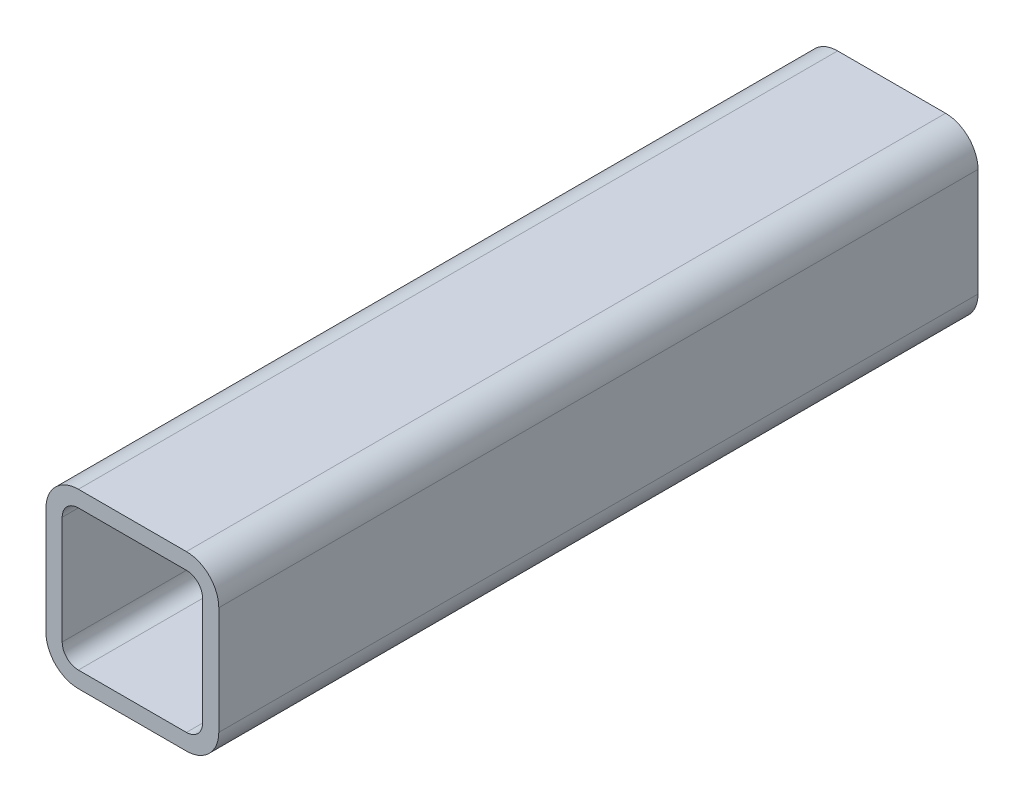
ISO-10303-21;
HEADER;
FILE_DESCRIPTION(('STEP AP214'),'2;1');
FILE_NAME('part.step','',(''),(''),'','','');
FILE_SCHEMA(('AUTOMOTIVE_DESIGN { 1 0 10303 214 1 1 1 1 }'));
ENDSEC;
DATA;
#1=APPLICATION_CONTEXT('core data for automotive mechanical design processes');
#2=APPLICATION_PROTOCOL_DEFINITION('international standard','automotive_design',2000,#1);
#3=PRODUCT_CONTEXT('',#1,'mechanical');
#4=PRODUCT('Part','Part','',(#3));
#5=PRODUCT_RELATED_PRODUCT_CATEGORY('part','',(#4));
#6=PRODUCT_DEFINITION_FORMATION('','',#4);
#7=PRODUCT_DEFINITION_CONTEXT('part definition',#1,'design');
#8=PRODUCT_DEFINITION('design','',#6,#7);
#9=PRODUCT_DEFINITION_SHAPE('','',#8);
#10=(LENGTH_UNIT() NAMED_UNIT(*) SI_UNIT(.MILLI.,.METRE.));
#11=(NAMED_UNIT(*) PLANE_ANGLE_UNIT() SI_UNIT($,.RADIAN.));
#12=(NAMED_UNIT(*) SI_UNIT($,.STERADIAN.) SOLID_ANGLE_UNIT());
#13=UNCERTAINTY_MEASURE_WITH_UNIT(LENGTH_MEASURE(1.E-05),#10,'distance_accuracy_value','');
#14=(GEOMETRIC_REPRESENTATION_CONTEXT(3) GLOBAL_UNCERTAINTY_ASSIGNED_CONTEXT((#13)) GLOBAL_UNIT_ASSIGNED_CONTEXT((#10,
#11,#12)) REPRESENTATION_CONTEXT('',''));
#15=CARTESIAN_POINT('',(0.,0.,0.));
#16=DIRECTION('',(0.,0.,1.));
#17=DIRECTION('',(1.,0.,0.));
#18=AXIS2_PLACEMENT_3D('',#15,#16,#17);
#19=CARTESIAN_POINT('',(41.27,41.27,223.2));
#20=DIRECTION('',(0.,0.,-1.));
#21=DIRECTION('',(-1.,0.,0.));
#22=AXIS2_PLACEMENT_3D('',#19,#20,#21);
#23=PLANE('',#22);
#24=CARTESIAN_POINT('',(41.27,41.27,223.2));
#25=DIRECTION('',(0.,0.,1.));
#26=DIRECTION('',(-1.,0.,0.));
#27=AXIS2_PLACEMENT_3D('',#24,#25,#26);
#28=CIRCLE('',#27,9.53);
#29=CARTESIAN_POINT('',(50.8,41.2699999999999,223.2));
#30=VERTEX_POINT('',#29);
#31=CARTESIAN_POINT('',(41.2699999999999,50.8,223.2));
#32=VERTEX_POINT('',#31);
#33=EDGE_CURVE('E246',#30,#32,#28,.T.);
#34=ORIENTED_EDGE('',*,*,#33,.T.);
#35=DIRECTION('',(-1.,0.,0.));
#36=VECTOR('',#35,1.);
#37=CARTESIAN_POINT('',(9.53000000000007,50.8,223.2));
#38=LINE('',#37,#36);
#39=CARTESIAN_POINT('',(9.53000000000007,50.8,223.2));
#40=VERTEX_POINT('',#39);
#41=EDGE_CURVE('E250',#32,#40,#38,.T.);
#42=ORIENTED_EDGE('',*,*,#41,.T.);
#43=CARTESIAN_POINT('',(9.53,41.27,223.2));
#44=DIRECTION('',(0.,0.,1.));
#45=DIRECTION('',(-1.,0.,0.));
#46=AXIS2_PLACEMENT_3D('',#43,#44,#45);
#47=CIRCLE('',#46,9.53);
#48=CARTESIAN_POINT('',(0.,41.2699999999999,223.2));
#49=VERTEX_POINT('',#48);
#50=EDGE_CURVE('E254',#40,#49,#47,.T.);
#51=ORIENTED_EDGE('',*,*,#50,.T.);
#52=DIRECTION('',(0.,-1.,0.));
#53=VECTOR('',#52,1.);
#54=CARTESIAN_POINT('',(0.,9.53000000000007,223.2));
#55=LINE('',#54,#53);
#56=CARTESIAN_POINT('',(0.,9.53000000000007,223.2));
#57=VERTEX_POINT('',#56);
#58=EDGE_CURVE('E257',#49,#57,#55,.T.);
#59=ORIENTED_EDGE('',*,*,#58,.T.);
#60=CARTESIAN_POINT('',(9.53,9.53,223.2));
#61=DIRECTION('',(0.,0.,1.));
#62=DIRECTION('',(-1.,0.,0.));
#63=AXIS2_PLACEMENT_3D('',#60,#61,#62);
#64=CIRCLE('',#63,9.53);
#65=CARTESIAN_POINT('',(9.53000000000007,0.,223.2));
#66=VERTEX_POINT('',#65);
#67=EDGE_CURVE('E260',#57,#66,#64,.T.);
#68=ORIENTED_EDGE('',*,*,#67,.T.);
#69=DIRECTION('',(1.,0.,0.));
#70=VECTOR('',#69,1.);
#71=CARTESIAN_POINT('',(9.53000000000007,0.,223.2));
#72=LINE('',#71,#70);
#73=CARTESIAN_POINT('',(41.2699999999999,0.,223.2));
#74=VERTEX_POINT('',#73);
#75=EDGE_CURVE('E263',#66,#74,#72,.T.);
#76=ORIENTED_EDGE('',*,*,#75,.T.);
#77=CARTESIAN_POINT('',(41.27,9.53,223.2));
#78=DIRECTION('',(0.,0.,1.));
#79=DIRECTION('',(-1.,0.,0.));
#80=AXIS2_PLACEMENT_3D('',#77,#78,#79);
#81=CIRCLE('',#80,9.53);
#82=CARTESIAN_POINT('',(50.8,9.53000000000007,223.2));
#83=VERTEX_POINT('',#82);
#84=EDGE_CURVE('E266',#74,#83,#81,.T.);
#85=ORIENTED_EDGE('',*,*,#84,.T.);
#86=DIRECTION('',(0.,1.,0.));
#87=VECTOR('',#86,1.);
#88=CARTESIAN_POINT('',(50.8,9.53000000000007,223.2));
#89=LINE('',#88,#87);
#90=EDGE_CURVE('E269',#83,#30,#89,.T.);
#91=ORIENTED_EDGE('',*,*,#90,.T.);
#92=EDGE_LOOP('',(#34,#42,#51,#59,#68,#76,#85,#91));
#93=FACE_BOUND('',#92,.T.);
#94=CARTESIAN_POINT('',(9.52,9.52,223.2));
#95=DIRECTION('',(0.,0.,1.));
#96=DIRECTION('',(1.,0.,0.));
#97=AXIS2_PLACEMENT_3D('',#94,#95,#96);
#98=CIRCLE('',#97,4.76);
#99=CARTESIAN_POINT('',(4.76,9.52000000000003,223.2));
#100=VERTEX_POINT('',#99);
#101=CARTESIAN_POINT('',(9.52000000000004,4.76,223.2));
#102=VERTEX_POINT('',#101);
#103=EDGE_CURVE('E157',#100,#102,#98,.T.);
#104=ORIENTED_EDGE('',*,*,#103,.F.);
#105=DIRECTION('',(0.,-1.,0.));
#106=VECTOR('',#105,1.);
#107=CARTESIAN_POINT('',(4.76,41.28,223.2));
#108=LINE('',#107,#106);
#109=CARTESIAN_POINT('',(4.76,41.28,223.2));
#110=VERTEX_POINT('',#109);
#111=EDGE_CURVE('E198',#110,#100,#108,.T.);
#112=ORIENTED_EDGE('',*,*,#111,.F.);
#113=CARTESIAN_POINT('',(9.52,41.28,223.2));
#114=DIRECTION('',(0.,0.,1.));
#115=DIRECTION('',(-1.,0.,0.));
#116=AXIS2_PLACEMENT_3D('',#113,#114,#115);
#117=CIRCLE('',#116,4.76);
#118=CARTESIAN_POINT('',(9.52000000000003,46.04,223.2));
#119=VERTEX_POINT('',#118);
#120=EDGE_CURVE('E195',#119,#110,#117,.T.);
#121=ORIENTED_EDGE('',*,*,#120,.F.);
#122=DIRECTION('',(-1.,0.,0.));
#123=VECTOR('',#122,1.);
#124=CARTESIAN_POINT('',(9.52000000000003,46.04,223.2));
#125=LINE('',#124,#123);
#126=CARTESIAN_POINT('',(41.28,46.04,223.2));
#127=VERTEX_POINT('',#126);
#128=EDGE_CURVE('E192',#127,#119,#125,.T.);
#129=ORIENTED_EDGE('',*,*,#128,.F.);
#130=CARTESIAN_POINT('',(41.28,41.28,223.2));
#131=DIRECTION('',(0.,0.,1.));
#132=DIRECTION('',(1.,0.,0.));
#133=AXIS2_PLACEMENT_3D('',#130,#131,#132);
#134=CIRCLE('',#133,4.76);
#135=CARTESIAN_POINT('',(46.04,41.28,223.2));
#136=VERTEX_POINT('',#135);
#137=EDGE_CURVE('E189',#136,#127,#134,.T.);
#138=ORIENTED_EDGE('',*,*,#137,.F.);
#139=DIRECTION('',(0.,1.,0.));
#140=VECTOR('',#139,1.);
#141=CARTESIAN_POINT('',(46.04,41.28,223.2));
#142=LINE('',#141,#140);
#143=CARTESIAN_POINT('',(46.04,9.52000000000003,223.2));
#144=VERTEX_POINT('',#143);
#145=EDGE_CURVE('E184',#144,#136,#142,.T.);
#146=ORIENTED_EDGE('',*,*,#145,.F.);
#147=CARTESIAN_POINT('',(41.28,9.52,223.2));
#148=DIRECTION('',(0.,0.,1.));
#149=DIRECTION('',(1.,0.,0.));
#150=AXIS2_PLACEMENT_3D('',#147,#148,#149);
#151=CIRCLE('',#150,4.76);
#152=CARTESIAN_POINT('',(41.28,4.76,223.2));
#153=VERTEX_POINT('',#152);
#154=EDGE_CURVE('E180',#153,#144,#151,.T.);
#155=ORIENTED_EDGE('',*,*,#154,.F.);
#156=DIRECTION('',(1.,0.,0.));
#157=VECTOR('',#156,1.);
#158=CARTESIAN_POINT('',(9.52000000000004,4.76,223.2));
#159=LINE('',#158,#157);
#160=EDGE_CURVE('E166',#102,#153,#159,.T.);
#161=ORIENTED_EDGE('',*,*,#160,.F.);
#162=EDGE_LOOP('',(#104,#112,#121,#129,#138,#146,#155,#161));
#163=FACE_BOUND('',#162,.T.);
#164=ADVANCED_FACE('F43',(#93,#163),#23,.F.);
#165=CARTESIAN_POINT('',(41.27,41.27,0.));
#166=DIRECTION('',(0.,0.,-1.));
#167=DIRECTION('',(-1.,0.,0.));
#168=AXIS2_PLACEMENT_3D('',#165,#166,#167);
#169=PLANE('',#168);
#170=CARTESIAN_POINT('',(41.27,41.27,0.));
#171=DIRECTION('',(0.,0.,1.));
#172=DIRECTION('',(-1.,0.,0.));
#173=AXIS2_PLACEMENT_3D('',#170,#171,#172);
#174=CIRCLE('',#173,9.53);
#175=CARTESIAN_POINT('',(50.8,41.2699999999999,0.));
#176=VERTEX_POINT('',#175);
#177=CARTESIAN_POINT('',(41.2699999999999,50.8,0.));
#178=VERTEX_POINT('',#177);
#179=EDGE_CURVE('E175',#176,#178,#174,.T.);
#180=ORIENTED_EDGE('',*,*,#179,.F.);
#181=DIRECTION('',(0.,1.,0.));
#182=VECTOR('',#181,1.);
#183=CARTESIAN_POINT('',(50.8,9.53000000000007,0.));
#184=LINE('',#183,#182);
#185=CARTESIAN_POINT('',(50.8,9.53000000000007,0.));
#186=VERTEX_POINT('',#185);
#187=EDGE_CURVE('E251',#186,#176,#184,.T.);
#188=ORIENTED_EDGE('',*,*,#187,.F.);
#189=CARTESIAN_POINT('',(41.27,9.53,0.));
#190=DIRECTION('',(0.,0.,1.));
#191=DIRECTION('',(-1.,0.,0.));
#192=AXIS2_PLACEMENT_3D('',#189,#190,#191);
#193=CIRCLE('',#192,9.53);
#194=CARTESIAN_POINT('',(41.2699999999999,0.,0.));
#195=VERTEX_POINT('',#194);
#196=EDGE_CURVE('E291',#195,#186,#193,.T.);
#197=ORIENTED_EDGE('',*,*,#196,.F.);
#198=DIRECTION('',(1.,0.,0.));
#199=VECTOR('',#198,1.);
#200=CARTESIAN_POINT('',(9.53000000000007,0.,0.));
#201=LINE('',#200,#199);
#202=CARTESIAN_POINT('',(9.53000000000007,0.,0.));
#203=VERTEX_POINT('',#202);
#204=EDGE_CURVE('E288',#203,#195,#201,.T.);
#205=ORIENTED_EDGE('',*,*,#204,.F.);
#206=CARTESIAN_POINT('',(9.53,9.53,0.));
#207=DIRECTION('',(0.,0.,1.));
#208=DIRECTION('',(-1.,0.,0.));
#209=AXIS2_PLACEMENT_3D('',#206,#207,#208);
#210=CIRCLE('',#209,9.53);
#211=CARTESIAN_POINT('',(0.,9.53000000000007,0.));
#212=VERTEX_POINT('',#211);
#213=EDGE_CURVE('E285',#212,#203,#210,.T.);
#214=ORIENTED_EDGE('',*,*,#213,.F.);
#215=DIRECTION('',(0.,-1.,0.));
#216=VECTOR('',#215,1.);
#217=CARTESIAN_POINT('',(0.,9.53000000000007,0.));
#218=LINE('',#217,#216);
#219=CARTESIAN_POINT('',(0.,41.2699999999999,0.));
#220=VERTEX_POINT('',#219);
#221=EDGE_CURVE('E282',#220,#212,#218,.T.);
#222=ORIENTED_EDGE('',*,*,#221,.F.);
#223=CARTESIAN_POINT('',(9.53,41.27,0.));
#224=DIRECTION('',(0.,0.,1.));
#225=DIRECTION('',(-1.,0.,0.));
#226=AXIS2_PLACEMENT_3D('',#223,#224,#225);
#227=CIRCLE('',#226,9.53);
#228=CARTESIAN_POINT('',(9.53000000000007,50.8,0.));
#229=VERTEX_POINT('',#228);
#230=EDGE_CURVE('E279',#229,#220,#227,.T.);
#231=ORIENTED_EDGE('',*,*,#230,.F.);
#232=DIRECTION('',(-1.,0.,0.));
#233=VECTOR('',#232,1.);
#234=CARTESIAN_POINT('',(9.53000000000007,50.8,0.));
#235=LINE('',#234,#233);
#236=EDGE_CURVE('E276',#178,#229,#235,.T.);
#237=ORIENTED_EDGE('',*,*,#236,.F.);
#238=EDGE_LOOP('',(#180,#188,#197,#205,#214,#222,#231,#237));
#239=FACE_BOUND('',#238,.T.);
#240=DIRECTION('',(0.,-1.,0.));
#241=VECTOR('',#240,1.);
#242=CARTESIAN_POINT('',(4.76,41.28,0.));
#243=LINE('',#242,#241);
#244=CARTESIAN_POINT('',(4.76,41.28,0.));
#245=VERTEX_POINT('',#244);
#246=CARTESIAN_POINT('',(4.76,9.52000000000004,0.));
#247=VERTEX_POINT('',#246);
#248=EDGE_CURVE('E167',#245,#247,#243,.T.);
#249=ORIENTED_EDGE('',*,*,#248,.T.);
#250=CARTESIAN_POINT('',(9.52,9.52,0.));
#251=DIRECTION('',(0.,0.,1.));
#252=DIRECTION('',(1.,0.,0.));
#253=AXIS2_PLACEMENT_3D('',#250,#251,#252);
#254=CIRCLE('',#253,4.76);
#255=CARTESIAN_POINT('',(9.52000000000004,4.76,0.));
#256=VERTEX_POINT('',#255);
#257=EDGE_CURVE('E67',#247,#256,#254,.T.);
#258=ORIENTED_EDGE('',*,*,#257,.T.);
#259=DIRECTION('',(1.,0.,0.));
#260=VECTOR('',#259,1.);
#261=CARTESIAN_POINT('',(9.52000000000004,4.76,0.));
#262=LINE('',#261,#260);
#263=CARTESIAN_POINT('',(41.28,4.76,0.));
#264=VERTEX_POINT('',#263);
#265=EDGE_CURVE('E173',#256,#264,#262,.T.);
#266=ORIENTED_EDGE('',*,*,#265,.T.);
#267=CARTESIAN_POINT('',(41.28,9.52,0.));
#268=DIRECTION('',(0.,0.,1.));
#269=DIRECTION('',(1.,0.,0.));
#270=AXIS2_PLACEMENT_3D('',#267,#268,#269);
#271=CIRCLE('',#270,4.76);
#272=CARTESIAN_POINT('',(46.04,9.52000000000003,0.));
#273=VERTEX_POINT('',#272);
#274=EDGE_CURVE('E205',#264,#273,#271,.T.);
#275=ORIENTED_EDGE('',*,*,#274,.T.);
#276=DIRECTION('',(0.,1.,0.));
#277=VECTOR('',#276,1.);
#278=CARTESIAN_POINT('',(46.04,41.28,0.));
#279=LINE('',#278,#277);
#280=CARTESIAN_POINT('',(46.04,41.28,0.));
#281=VERTEX_POINT('',#280);
#282=EDGE_CURVE('E209',#273,#281,#279,.T.);
#283=ORIENTED_EDGE('',*,*,#282,.T.);
#284=CARTESIAN_POINT('',(41.28,41.28,0.));
#285=DIRECTION('',(0.,0.,1.));
#286=DIRECTION('',(1.,0.,0.));
#287=AXIS2_PLACEMENT_3D('',#284,#285,#286);
#288=CIRCLE('',#287,4.76);
#289=CARTESIAN_POINT('',(41.28,46.04,0.));
#290=VERTEX_POINT('',#289);
#291=EDGE_CURVE('E213',#281,#290,#288,.T.);
#292=ORIENTED_EDGE('',*,*,#291,.T.);
#293=DIRECTION('',(-1.,0.,0.));
#294=VECTOR('',#293,1.);
#295=CARTESIAN_POINT('',(9.52000000000003,46.04,0.));
#296=LINE('',#295,#294);
#297=CARTESIAN_POINT('',(9.52000000000003,46.04,0.));
#298=VERTEX_POINT('',#297);
#299=EDGE_CURVE('E217',#290,#298,#296,.T.);
#300=ORIENTED_EDGE('',*,*,#299,.T.);
#301=CARTESIAN_POINT('',(9.52,41.28,0.));
#302=DIRECTION('',(0.,0.,1.));
#303=DIRECTION('',(-1.,0.,0.));
#304=AXIS2_PLACEMENT_3D('',#301,#302,#303);
#305=CIRCLE('',#304,4.76);
#306=EDGE_CURVE('E221',#298,#245,#305,.T.);
#307=ORIENTED_EDGE('',*,*,#306,.T.);
#308=EDGE_LOOP('',(#249,#258,#266,#275,#283,#292,#300,#307));
#309=FACE_BOUND('',#308,.T.);
#310=ADVANCED_FACE('F330',(#239,#309),#169,.T.);
#311=CARTESIAN_POINT('',(41.27,41.27,223.2));
#312=DIRECTION('',(0.,0.,-1.));
#313=DIRECTION('',(-1.,0.,0.));
#314=AXIS2_PLACEMENT_3D('',#311,#312,#313);
#315=CYLINDRICAL_SURFACE('',#314,9.53);
#316=ORIENTED_EDGE('',*,*,#179,.T.);
#317=DIRECTION('',(0.,0.,-1.));
#318=VECTOR('',#317,1.);
#319=CARTESIAN_POINT('',(41.2699999999999,50.8,223.2));
#320=LINE('',#319,#318);
#321=EDGE_CURVE('E11',#32,#178,#320,.T.);
#322=ORIENTED_EDGE('',*,*,#321,.F.);
#323=ORIENTED_EDGE('',*,*,#33,.F.);
#324=DIRECTION('',(0.,0.,-1.));
#325=VECTOR('',#324,1.);
#326=CARTESIAN_POINT('',(50.8,41.2699999999999,223.2));
#327=LINE('',#326,#325);
#328=EDGE_CURVE('E272',#30,#176,#327,.T.);
#329=ORIENTED_EDGE('',*,*,#328,.T.);
#330=EDGE_LOOP('',(#316,#322,#323,#329));
#331=FACE_BOUND('',#330,.T.);
#332=ADVANCED_FACE('F45',(#331),#315,.T.);
#333=CARTESIAN_POINT('',(9.53000000000007,50.8,223.2));
#334=DIRECTION('',(0.,-1.,0.));
#335=DIRECTION('',(0.,0.,-1.));
#336=AXIS2_PLACEMENT_3D('',#333,#334,#335);
#337=PLANE('',#336);
#338=ORIENTED_EDGE('',*,*,#236,.T.);
#339=DIRECTION('',(0.,0.,-1.));
#340=VECTOR('',#339,1.);
#341=CARTESIAN_POINT('',(9.53000000000007,50.8,223.2));
#342=LINE('',#341,#340);
#343=EDGE_CURVE('E52',#40,#229,#342,.T.);
#344=ORIENTED_EDGE('',*,*,#343,.F.);
#345=ORIENTED_EDGE('',*,*,#41,.F.);
#346=ORIENTED_EDGE('',*,*,#321,.T.);
#347=EDGE_LOOP('',(#338,#344,#345,#346));
#348=FACE_BOUND('',#347,.T.);
#349=ADVANCED_FACE('F347',(#348),#337,.F.);
#350=CARTESIAN_POINT('',(9.53,41.27,223.2));
#351=DIRECTION('',(0.,0.,-1.));
#352=DIRECTION('',(-1.,0.,0.));
#353=AXIS2_PLACEMENT_3D('',#350,#351,#352);
#354=CYLINDRICAL_SURFACE('',#353,9.53);
#355=ORIENTED_EDGE('',*,*,#230,.T.);
#356=DIRECTION('',(0.,0.,-1.));
#357=VECTOR('',#356,1.);
#358=CARTESIAN_POINT('',(0.,41.2699999999999,223.2));
#359=LINE('',#358,#357);
#360=EDGE_CURVE('E315',#49,#220,#359,.T.);
#361=ORIENTED_EDGE('',*,*,#360,.F.);
#362=ORIENTED_EDGE('',*,*,#50,.F.);
#363=ORIENTED_EDGE('',*,*,#343,.T.);
#364=EDGE_LOOP('',(#355,#361,#362,#363));
#365=FACE_BOUND('',#364,.T.);
#366=ADVANCED_FACE('F324',(#365),#354,.T.);
#367=CARTESIAN_POINT('',(0.,9.53000000000007,223.2));
#368=DIRECTION('',(1.,0.,0.));
#369=DIRECTION('',(0.,0.,-1.));
#370=AXIS2_PLACEMENT_3D('',#367,#368,#369);
#371=PLANE('',#370);
#372=ORIENTED_EDGE('',*,*,#221,.T.);
#373=DIRECTION('',(0.,0.,-1.));
#374=VECTOR('',#373,1.);
#375=CARTESIAN_POINT('',(0.,9.53000000000007,223.2));
#376=LINE('',#375,#374);
#377=EDGE_CURVE('E311',#57,#212,#376,.T.);
#378=ORIENTED_EDGE('',*,*,#377,.F.);
#379=ORIENTED_EDGE('',*,*,#58,.F.);
#380=ORIENTED_EDGE('',*,*,#360,.T.);
#381=EDGE_LOOP('',(#372,#378,#379,#380));
#382=FACE_BOUND('',#381,.T.);
#383=ADVANCED_FACE('F336',(#382),#371,.F.);
#384=CARTESIAN_POINT('',(9.53,9.53,223.2));
#385=DIRECTION('',(0.,0.,-1.));
#386=DIRECTION('',(-1.,0.,0.));
#387=AXIS2_PLACEMENT_3D('',#384,#385,#386);
#388=CYLINDRICAL_SURFACE('',#387,9.53);
#389=ORIENTED_EDGE('',*,*,#213,.T.);
#390=DIRECTION('',(0.,0.,-1.));
#391=VECTOR('',#390,1.);
#392=CARTESIAN_POINT('',(9.53000000000007,0.,223.2));
#393=LINE('',#392,#391);
#394=EDGE_CURVE('E307',#66,#203,#393,.T.);
#395=ORIENTED_EDGE('',*,*,#394,.F.);
#396=ORIENTED_EDGE('',*,*,#67,.F.);
#397=ORIENTED_EDGE('',*,*,#377,.T.);
#398=EDGE_LOOP('',(#389,#395,#396,#397));
#399=FACE_BOUND('',#398,.T.);
#400=ADVANCED_FACE('F340',(#399),#388,.T.);
#401=CARTESIAN_POINT('',(9.53000000000007,0.,223.2));
#402=DIRECTION('',(0.,1.,0.));
#403=DIRECTION('',(0.,0.,1.));
#404=AXIS2_PLACEMENT_3D('',#401,#402,#403);
#405=PLANE('',#404);
#406=ORIENTED_EDGE('',*,*,#204,.T.);
#407=DIRECTION('',(0.,0.,-1.));
#408=VECTOR('',#407,1.);
#409=CARTESIAN_POINT('',(41.2699999999999,0.,223.2));
#410=LINE('',#409,#408);
#411=EDGE_CURVE('E303',#74,#195,#410,.T.);
#412=ORIENTED_EDGE('',*,*,#411,.F.);
#413=ORIENTED_EDGE('',*,*,#75,.F.);
#414=ORIENTED_EDGE('',*,*,#394,.T.);
#415=EDGE_LOOP('',(#406,#412,#413,#414));
#416=FACE_BOUND('',#415,.T.);
#417=ADVANCED_FACE('F360',(#416),#405,.F.);
#418=CARTESIAN_POINT('',(41.27,9.53,223.2));
#419=DIRECTION('',(0.,0.,-1.));
#420=DIRECTION('',(-1.,0.,0.));
#421=AXIS2_PLACEMENT_3D('',#418,#419,#420);
#422=CYLINDRICAL_SURFACE('',#421,9.53);
#423=ORIENTED_EDGE('',*,*,#196,.T.);
#424=DIRECTION('',(0.,0.,-1.));
#425=VECTOR('',#424,1.);
#426=CARTESIAN_POINT('',(50.8,9.53000000000007,223.2));
#427=LINE('',#426,#425);
#428=EDGE_CURVE('E299',#83,#186,#427,.T.);
#429=ORIENTED_EDGE('',*,*,#428,.F.);
#430=ORIENTED_EDGE('',*,*,#84,.F.);
#431=ORIENTED_EDGE('',*,*,#411,.T.);
#432=EDGE_LOOP('',(#423,#429,#430,#431));
#433=FACE_BOUND('',#432,.T.);
#434=ADVANCED_FACE('F358',(#433),#422,.T.);
#435=CARTESIAN_POINT('',(50.8,9.53000000000007,223.2));
#436=DIRECTION('',(-1.,0.,0.));
#437=DIRECTION('',(0.,0.,1.));
#438=AXIS2_PLACEMENT_3D('',#435,#436,#437);
#439=PLANE('',#438);
#440=ORIENTED_EDGE('',*,*,#187,.T.);
#441=ORIENTED_EDGE('',*,*,#328,.F.);
#442=ORIENTED_EDGE('',*,*,#90,.F.);
#443=ORIENTED_EDGE('',*,*,#428,.T.);
#444=EDGE_LOOP('',(#440,#441,#442,#443));
#445=FACE_BOUND('',#444,.T.);
#446=ADVANCED_FACE('F353',(#445),#439,.F.);
#447=CARTESIAN_POINT('',(9.52,9.52,223.2));
#448=DIRECTION('',(0.,0.,-1.));
#449=DIRECTION('',(-1.,0.,0.));
#450=AXIS2_PLACEMENT_3D('',#447,#448,#449);
#451=CYLINDRICAL_SURFACE('',#450,4.76);
#452=ORIENTED_EDGE('',*,*,#257,.F.);
#453=DIRECTION('',(0.,0.,-1.));
#454=VECTOR('',#453,1.);
#455=CARTESIAN_POINT('',(4.76,9.52000000000003,223.2));
#456=LINE('',#455,#454);
#457=EDGE_CURVE('E161',#100,#247,#456,.T.);
#458=ORIENTED_EDGE('',*,*,#457,.F.);
#459=ORIENTED_EDGE('',*,*,#103,.T.);
#460=DIRECTION('',(0.,0.,-1.));
#461=VECTOR('',#460,1.);
#462=CARTESIAN_POINT('',(9.52000000000004,4.76,223.2));
#463=LINE('',#462,#461);
#464=EDGE_CURVE('E160',#102,#256,#463,.T.);
#465=ORIENTED_EDGE('',*,*,#464,.T.);
#466=EDGE_LOOP('',(#452,#458,#459,#465));
#467=FACE_BOUND('',#466,.T.);
#468=ADVANCED_FACE('F159',(#467),#451,.F.);
#469=CARTESIAN_POINT('',(9.52000000000004,4.76,223.2));
#470=DIRECTION('',(0.,1.,0.));
#471=DIRECTION('',(-1.,0.,0.));
#472=AXIS2_PLACEMENT_3D('',#469,#470,#471);
#473=PLANE('',#472);
#474=ORIENTED_EDGE('',*,*,#265,.F.);
#475=ORIENTED_EDGE('',*,*,#464,.F.);
#476=ORIENTED_EDGE('',*,*,#160,.T.);
#477=DIRECTION('',(0.,0.,-1.));
#478=VECTOR('',#477,1.);
#479=CARTESIAN_POINT('',(41.28,4.76,223.2));
#480=LINE('',#479,#478);
#481=EDGE_CURVE('E176',#153,#264,#480,.T.);
#482=ORIENTED_EDGE('',*,*,#481,.T.);
#483=EDGE_LOOP('',(#474,#475,#476,#482));
#484=FACE_BOUND('',#483,.T.);
#485=ADVANCED_FACE('F170',(#484),#473,.T.);
#486=CARTESIAN_POINT('',(41.28,9.52,223.2));
#487=DIRECTION('',(0.,0.,-1.));
#488=DIRECTION('',(-1.,0.,0.));
#489=AXIS2_PLACEMENT_3D('',#486,#487,#488);
#490=CYLINDRICAL_SURFACE('',#489,4.76);
#491=ORIENTED_EDGE('',*,*,#274,.F.);
#492=ORIENTED_EDGE('',*,*,#481,.F.);
#493=ORIENTED_EDGE('',*,*,#154,.T.);
#494=DIRECTION('',(0.,0.,-1.));
#495=VECTOR('',#494,1.);
#496=CARTESIAN_POINT('',(46.04,9.52000000000003,223.2));
#497=LINE('',#496,#495);
#498=EDGE_CURVE('E241',#144,#273,#497,.T.);
#499=ORIENTED_EDGE('',*,*,#498,.T.);
#500=EDGE_LOOP('',(#491,#492,#493,#499));
#501=FACE_BOUND('',#500,.T.);
#502=ADVANCED_FACE('F385',(#501),#490,.F.);
#503=CARTESIAN_POINT('',(46.04,41.28,223.2));
#504=DIRECTION('',(-1.,0.,0.));
#505=DIRECTION('',(0.,-1.,0.));
#506=AXIS2_PLACEMENT_3D('',#503,#504,#505);
#507=PLANE('',#506);
#508=ORIENTED_EDGE('',*,*,#282,.F.);
#509=ORIENTED_EDGE('',*,*,#498,.F.);
#510=ORIENTED_EDGE('',*,*,#145,.T.);
#511=DIRECTION('',(0.,0.,-1.));
#512=VECTOR('',#511,1.);
#513=CARTESIAN_POINT('',(46.04,41.28,223.2));
#514=LINE('',#513,#512);
#515=EDGE_CURVE('E238',#136,#281,#514,.T.);
#516=ORIENTED_EDGE('',*,*,#515,.T.);
#517=EDGE_LOOP('',(#508,#509,#510,#516));
#518=FACE_BOUND('',#517,.T.);
#519=ADVANCED_FACE('F389',(#518),#507,.T.);
#520=CARTESIAN_POINT('',(41.28,41.28,223.2));
#521=DIRECTION('',(0.,0.,-1.));
#522=DIRECTION('',(-1.,0.,0.));
#523=AXIS2_PLACEMENT_3D('',#520,#521,#522);
#524=CYLINDRICAL_SURFACE('',#523,4.76);
#525=ORIENTED_EDGE('',*,*,#291,.F.);
#526=ORIENTED_EDGE('',*,*,#515,.F.);
#527=ORIENTED_EDGE('',*,*,#137,.T.);
#528=DIRECTION('',(0.,0.,-1.));
#529=VECTOR('',#528,1.);
#530=CARTESIAN_POINT('',(41.28,46.04,223.2));
#531=LINE('',#530,#529);
#532=EDGE_CURVE('E235',#127,#290,#531,.T.);
#533=ORIENTED_EDGE('',*,*,#532,.T.);
#534=EDGE_LOOP('',(#525,#526,#527,#533));
#535=FACE_BOUND('',#534,.T.);
#536=ADVANCED_FACE('F395',(#535),#524,.F.);
#537=CARTESIAN_POINT('',(9.52000000000003,46.04,223.2));
#538=DIRECTION('',(0.,-1.,0.));
#539=DIRECTION('',(0.,0.,-1.));
#540=AXIS2_PLACEMENT_3D('',#537,#538,#539);
#541=PLANE('',#540);
#542=ORIENTED_EDGE('',*,*,#299,.F.);
#543=ORIENTED_EDGE('',*,*,#532,.F.);
#544=ORIENTED_EDGE('',*,*,#128,.T.);
#545=DIRECTION('',(0.,0.,-1.));
#546=VECTOR('',#545,1.);
#547=CARTESIAN_POINT('',(9.52000000000003,46.04,223.2));
#548=LINE('',#547,#546);
#549=EDGE_CURVE('E232',#119,#298,#548,.T.);
#550=ORIENTED_EDGE('',*,*,#549,.T.);
#551=EDGE_LOOP('',(#542,#543,#544,#550));
#552=FACE_BOUND('',#551,.T.);
#553=ADVANCED_FACE('F399',(#552),#541,.T.);
#554=CARTESIAN_POINT('',(9.52,41.28,223.2));
#555=DIRECTION('',(0.,0.,-1.));
#556=DIRECTION('',(-1.,0.,0.));
#557=AXIS2_PLACEMENT_3D('',#554,#555,#556);
#558=CYLINDRICAL_SURFACE('',#557,4.76);
#559=ORIENTED_EDGE('',*,*,#306,.F.);
#560=ORIENTED_EDGE('',*,*,#549,.F.);
#561=ORIENTED_EDGE('',*,*,#120,.T.);
#562=DIRECTION('',(0.,0.,-1.));
#563=VECTOR('',#562,1.);
#564=CARTESIAN_POINT('',(4.76,41.28,223.2));
#565=LINE('',#564,#563);
#566=EDGE_CURVE('E59',#110,#245,#565,.T.);
#567=ORIENTED_EDGE('',*,*,#566,.T.);
#568=EDGE_LOOP('',(#559,#560,#561,#567));
#569=FACE_BOUND('',#568,.T.);
#570=ADVANCED_FACE('F403',(#569),#558,.F.);
#571=CARTESIAN_POINT('',(4.76,41.28,223.2));
#572=DIRECTION('',(1.,0.,0.));
#573=DIRECTION('',(0.,1.,0.));
#574=AXIS2_PLACEMENT_3D('',#571,#572,#573);
#575=PLANE('',#574);
#576=ORIENTED_EDGE('',*,*,#248,.F.);
#577=ORIENTED_EDGE('',*,*,#566,.F.);
#578=ORIENTED_EDGE('',*,*,#111,.T.);
#579=ORIENTED_EDGE('',*,*,#457,.T.);
#580=EDGE_LOOP('',(#576,#577,#578,#579));
#581=FACE_BOUND('',#580,.T.);
#582=ADVANCED_FACE('F407',(#581),#575,.T.);
#583=CLOSED_SHELL('',(#164,#310,#332,#349,#366,#383,#400,#417,#434,#446,#468,#485,#502,#519,
#536,#553,#570,#582));
#584=MANIFOLD_SOLID_BREP('B2',#583);
#585=ADVANCED_BREP_SHAPE_REPRESENTATION('',(#18,#584),#14);
#586=SHAPE_DEFINITION_REPRESENTATION(#9,#585);
ENDSEC;
END-ISO-10303-21;
